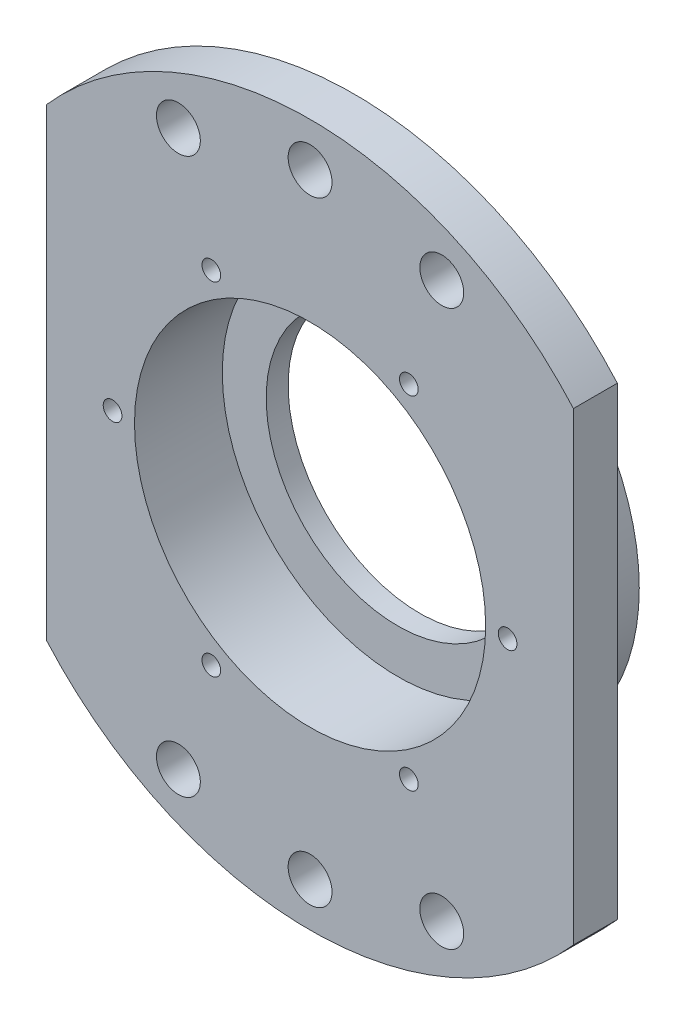
ISO-10303-21;
HEADER;
FILE_DESCRIPTION(('STEP AP214'),'2;1');
FILE_NAME('part.step','',(''),(''),'','','');
FILE_SCHEMA(('AUTOMOTIVE_DESIGN { 1 0 10303 214 1 1 1 1 }'));
ENDSEC;
DATA;
#1=APPLICATION_CONTEXT('core data for automotive mechanical design processes');
#2=APPLICATION_PROTOCOL_DEFINITION('international standard','automotive_design',2000,#1);
#3=PRODUCT_CONTEXT('',#1,'mechanical');
#4=PRODUCT('Part','Part','',(#3));
#5=PRODUCT_RELATED_PRODUCT_CATEGORY('part','',(#4));
#6=PRODUCT_DEFINITION_FORMATION('','',#4);
#7=PRODUCT_DEFINITION_CONTEXT('part definition',#1,'design');
#8=PRODUCT_DEFINITION('design','',#6,#7);
#9=PRODUCT_DEFINITION_SHAPE('','',#8);
#10=(LENGTH_UNIT() NAMED_UNIT(*) SI_UNIT(.MILLI.,.METRE.));
#11=(NAMED_UNIT(*) PLANE_ANGLE_UNIT() SI_UNIT($,.RADIAN.));
#12=(NAMED_UNIT(*) SI_UNIT($,.STERADIAN.) SOLID_ANGLE_UNIT());
#13=UNCERTAINTY_MEASURE_WITH_UNIT(LENGTH_MEASURE(1.E-05),#10,'distance_accuracy_value','');
#14=(GEOMETRIC_REPRESENTATION_CONTEXT(3) GLOBAL_UNCERTAINTY_ASSIGNED_CONTEXT((#13)) GLOBAL_UNIT_ASSIGNED_CONTEXT((#10,
#11,#12)) REPRESENTATION_CONTEXT('',''));
#15=CARTESIAN_POINT('',(0.,0.,0.));
#16=DIRECTION('',(0.,0.,1.));
#17=DIRECTION('',(1.,0.,0.));
#18=AXIS2_PLACEMENT_3D('',#15,#16,#17);
#19=CARTESIAN_POINT('',(0.,0.,7.9375));
#20=DIRECTION('',(0.,0.,-1.));
#21=DIRECTION('',(-1.,0.,0.));
#22=AXIS2_PLACEMENT_3D('',#19,#20,#21);
#23=PLANE('',#22);
#24=CARTESIAN_POINT('',(19.05,40.1609262841384,7.9375));
#25=DIRECTION('',(0.,0.,1.));
#26=DIRECTION('',(1.,0.,0.));
#27=AXIS2_PLACEMENT_3D('',#24,#25,#26);
#28=CIRCLE('',#27,3.17499999999999);
#29=CARTESIAN_POINT('',(22.225,40.1609262841384,7.9375));
#30=VERTEX_POINT('',#29);
#31=EDGE_CURVE('E179',#30,#30,#28,.T.);
#32=ORIENTED_EDGE('',*,*,#31,.F.);
#33=EDGE_LOOP('',(#32));
#34=FACE_BOUND('',#33,.T.);
#35=CARTESIAN_POINT('',(19.05,-40.1609262841384,7.9375));
#36=DIRECTION('',(0.,0.,1.));
#37=DIRECTION('',(1.,0.,0.));
#38=AXIS2_PLACEMENT_3D('',#35,#36,#37);
#39=CIRCLE('',#38,3.17499999999999);
#40=CARTESIAN_POINT('',(22.225,-40.1609262841384,7.9375));
#41=VERTEX_POINT('',#40);
#42=EDGE_CURVE('E164',#41,#41,#39,.T.);
#43=ORIENTED_EDGE('',*,*,#42,.F.);
#44=EDGE_LOOP('',(#43));
#45=FACE_BOUND('',#44,.T.);
#46=CARTESIAN_POINT('',(-19.05,-40.1609262841384,7.9375));
#47=DIRECTION('',(0.,0.,1.));
#48=DIRECTION('',(1.,0.,0.));
#49=AXIS2_PLACEMENT_3D('',#46,#47,#48);
#50=CIRCLE('',#49,3.17499999999999);
#51=CARTESIAN_POINT('',(-15.875,-40.1609262841384,7.9375));
#52=VERTEX_POINT('',#51);
#53=EDGE_CURVE('E160',#52,#52,#50,.T.);
#54=ORIENTED_EDGE('',*,*,#53,.F.);
#55=EDGE_LOOP('',(#54));
#56=FACE_BOUND('',#55,.T.);
#57=CARTESIAN_POINT('',(-19.05,40.1609262841384,7.9375));
#58=DIRECTION('',(0.,0.,1.));
#59=DIRECTION('',(1.,0.,0.));
#60=AXIS2_PLACEMENT_3D('',#57,#58,#59);
#61=CIRCLE('',#60,3.175);
#62=CARTESIAN_POINT('',(-15.875,40.1609262841384,7.9375));
#63=VERTEX_POINT('',#62);
#64=EDGE_CURVE('E159',#63,#63,#61,.T.);
#65=ORIENTED_EDGE('',*,*,#64,.F.);
#66=EDGE_LOOP('',(#65));
#67=FACE_BOUND('',#66,.T.);
#68=CARTESIAN_POINT('',(14.2875000000003,-24.7466759131402,7.9375));
#69=DIRECTION('',(0.,0.,1.));
#70=DIRECTION('',(1.,0.,0.));
#71=AXIS2_PLACEMENT_3D('',#68,#69,#70);
#72=CIRCLE('',#71,1.35255);
#73=CARTESIAN_POINT('',(15.6400500000003,-24.7466759131402,7.9375));
#74=VERTEX_POINT('',#73);
#75=EDGE_CURVE('E189',#74,#74,#72,.T.);
#76=ORIENTED_EDGE('',*,*,#75,.F.);
#77=EDGE_LOOP('',(#76));
#78=FACE_BOUND('',#77,.T.);
#79=CARTESIAN_POINT('',(-14.2874999999998,-24.7466759131405,7.9375));
#80=DIRECTION('',(0.,0.,1.));
#81=DIRECTION('',(1.,0.,0.));
#82=AXIS2_PLACEMENT_3D('',#79,#80,#81);
#83=CIRCLE('',#82,1.35255);
#84=CARTESIAN_POINT('',(-12.9349499999998,-24.7466759131405,7.9375));
#85=VERTEX_POINT('',#84);
#86=EDGE_CURVE('E197',#85,#85,#83,.T.);
#87=ORIENTED_EDGE('',*,*,#86,.F.);
#88=EDGE_LOOP('',(#87));
#89=FACE_BOUND('',#88,.T.);
#90=CARTESIAN_POINT('',(-28.575,0.,7.9375));
#91=DIRECTION('',(0.,0.,1.));
#92=DIRECTION('',(1.,0.,0.));
#93=AXIS2_PLACEMENT_3D('',#90,#91,#92);
#94=CIRCLE('',#93,1.35255);
#95=CARTESIAN_POINT('',(-27.22245,0.,7.9375));
#96=VERTEX_POINT('',#95);
#97=EDGE_CURVE('E205',#96,#96,#94,.T.);
#98=ORIENTED_EDGE('',*,*,#97,.F.);
#99=EDGE_LOOP('',(#98));
#100=FACE_BOUND('',#99,.T.);
#101=CARTESIAN_POINT('',(14.2874999999999,24.7466759131404,7.9375));
#102=DIRECTION('',(0.,0.,1.));
#103=DIRECTION('',(1.,0.,0.));
#104=AXIS2_PLACEMENT_3D('',#101,#102,#103);
#105=CIRCLE('',#104,1.35255);
#106=CARTESIAN_POINT('',(15.6400499999999,24.7466759131404,7.9375));
#107=VERTEX_POINT('',#106);
#108=EDGE_CURVE('E221',#107,#107,#105,.T.);
#109=ORIENTED_EDGE('',*,*,#108,.F.);
#110=EDGE_LOOP('',(#109));
#111=FACE_BOUND('',#110,.T.);
#112=CARTESIAN_POINT('',(28.575,0.,7.9375));
#113=DIRECTION('',(0.,0.,1.));
#114=DIRECTION('',(1.,0.,0.));
#115=AXIS2_PLACEMENT_3D('',#112,#113,#114);
#116=CIRCLE('',#115,1.35255);
#117=CARTESIAN_POINT('',(29.92755,0.,7.9375));
#118=VERTEX_POINT('',#117);
#119=EDGE_CURVE('E229',#118,#118,#116,.T.);
#120=ORIENTED_EDGE('',*,*,#119,.F.);
#121=EDGE_LOOP('',(#120));
#122=FACE_BOUND('',#121,.T.);
#123=CARTESIAN_POINT('',(0.,-44.45,7.9375));
#124=DIRECTION('',(0.,0.,1.));
#125=DIRECTION('',(-1.,0.,0.));
#126=AXIS2_PLACEMENT_3D('',#123,#124,#125);
#127=CIRCLE('',#126,3.175);
#128=CARTESIAN_POINT('',(-3.17499999999999,-44.45,7.9375));
#129=VERTEX_POINT('',#128);
#130=EDGE_CURVE('E155',#129,#129,#127,.T.);
#131=ORIENTED_EDGE('',*,*,#130,.F.);
#132=EDGE_LOOP('',(#131));
#133=FACE_BOUND('',#132,.T.);
#134=CARTESIAN_POINT('',(0.,44.45,7.9375));
#135=DIRECTION('',(0.,0.,1.));
#136=DIRECTION('',(1.,0.,0.));
#137=AXIS2_PLACEMENT_3D('',#134,#135,#136);
#138=CIRCLE('',#137,3.175);
#139=CARTESIAN_POINT('',(3.17499999999999,44.45,7.9375));
#140=VERTEX_POINT('',#139);
#141=EDGE_CURVE('E150',#140,#140,#138,.T.);
#142=ORIENTED_EDGE('',*,*,#141,.F.);
#143=EDGE_LOOP('',(#142));
#144=FACE_BOUND('',#143,.T.);
#145=CARTESIAN_POINT('',(0.,0.,7.9375));
#146=DIRECTION('',(0.,0.,1.));
#147=DIRECTION('',(1.,0.,0.));
#148=AXIS2_PLACEMENT_3D('',#145,#146,#147);
#149=CIRCLE('',#148,25.4);
#150=CARTESIAN_POINT('',(25.4,0.,7.9375));
#151=VERTEX_POINT('',#150);
#152=EDGE_CURVE('E149',#151,#151,#149,.T.);
#153=ORIENTED_EDGE('',*,*,#152,.F.);
#154=EDGE_LOOP('',(#153));
#155=FACE_BOUND('',#154,.T.);
#156=CARTESIAN_POINT('',(0.,0.,7.9375));
#157=DIRECTION('',(0.,0.,-1.));
#158=DIRECTION('',(-1.,0.,0.));
#159=AXIS2_PLACEMENT_3D('',#156,#157,#158);
#160=CIRCLE('',#159,50.8);
#161=CARTESIAN_POINT('',(38.1,-33.6010416505203,7.9375));
#162=VERTEX_POINT('',#161);
#163=CARTESIAN_POINT('',(-38.1,-33.6010416505203,7.9375));
#164=VERTEX_POINT('',#163);
#165=EDGE_CURVE('E116',#162,#164,#160,.T.);
#166=ORIENTED_EDGE('',*,*,#165,.F.);
#167=DIRECTION('',(0.,-1.,0.));
#168=VECTOR('',#167,1.);
#169=CARTESIAN_POINT('',(38.1,33.6010416505203,7.9375));
#170=LINE('',#169,#168);
#171=CARTESIAN_POINT('',(38.1,33.6010416505203,7.9375));
#172=VERTEX_POINT('',#171);
#173=EDGE_CURVE('E111',#172,#162,#170,.T.);
#174=ORIENTED_EDGE('',*,*,#173,.F.);
#175=CARTESIAN_POINT('',(0.,0.,7.9375));
#176=DIRECTION('',(0.,0.,-1.));
#177=DIRECTION('',(-1.,0.,0.));
#178=AXIS2_PLACEMENT_3D('',#175,#176,#177);
#179=CIRCLE('',#178,50.8);
#180=CARTESIAN_POINT('',(-38.1,33.6010416505203,7.9375));
#181=VERTEX_POINT('',#180);
#182=EDGE_CURVE('E102',#181,#172,#179,.T.);
#183=ORIENTED_EDGE('',*,*,#182,.F.);
#184=DIRECTION('',(0.,1.,0.));
#185=VECTOR('',#184,1.);
#186=CARTESIAN_POINT('',(-38.1,-33.6010416505203,7.9375));
#187=LINE('',#186,#185);
#188=EDGE_CURVE('E110',#164,#181,#187,.T.);
#189=ORIENTED_EDGE('',*,*,#188,.F.);
#190=EDGE_LOOP('',(#166,#174,#183,#189));
#191=FACE_BOUND('',#190,.T.);
#192=CARTESIAN_POINT('',(-14.2875000000001,24.7466759131403,7.9375));
#193=DIRECTION('',(0.,0.,1.));
#194=DIRECTION('',(1.,0.,0.));
#195=AXIS2_PLACEMENT_3D('',#192,#193,#194);
#196=CIRCLE('',#195,1.35255);
#197=CARTESIAN_POINT('',(-12.9349500000001,24.7466759131403,7.9375));
#198=VERTEX_POINT('',#197);
#199=EDGE_CURVE('E213',#198,#198,#196,.T.);
#200=ORIENTED_EDGE('',*,*,#199,.F.);
#201=EDGE_LOOP('',(#200));
#202=FACE_BOUND('',#201,.T.);
#203=ADVANCED_FACE('F49',(#34,#45,#56,#67,#78,#89,#100,#111,#122,#133,#144,#155,#191,#202),#23,.F.);
#204=CARTESIAN_POINT('',(31.75,0.,-7.9375));
#205=DIRECTION('',(0.,0.,-1.));
#206=DIRECTION('',(-1.,0.,0.));
#207=AXIS2_PLACEMENT_3D('',#204,#205,#206);
#208=PLANE('',#207);
#209=CARTESIAN_POINT('',(14.2875000000003,-24.7466759131402,-7.9375));
#210=DIRECTION('',(0.,0.,1.));
#211=DIRECTION('',(1.,0.,0.));
#212=AXIS2_PLACEMENT_3D('',#209,#210,#211);
#213=CIRCLE('',#212,1.35255);
#214=CARTESIAN_POINT('',(15.6400500000003,-24.7466759131402,-7.9375));
#215=VERTEX_POINT('',#214);
#216=EDGE_CURVE('E193',#215,#215,#213,.T.);
#217=ORIENTED_EDGE('',*,*,#216,.T.);
#218=EDGE_LOOP('',(#217));
#219=FACE_BOUND('',#218,.T.);
#220=CARTESIAN_POINT('',(-14.2874999999998,-24.7466759131405,-7.9375));
#221=DIRECTION('',(0.,0.,1.));
#222=DIRECTION('',(1.,0.,0.));
#223=AXIS2_PLACEMENT_3D('',#220,#221,#222);
#224=CIRCLE('',#223,1.35254999999999);
#225=CARTESIAN_POINT('',(-12.9349499999998,-24.7466759131405,-7.9375));
#226=VERTEX_POINT('',#225);
#227=EDGE_CURVE('E201',#226,#226,#224,.T.);
#228=ORIENTED_EDGE('',*,*,#227,.T.);
#229=EDGE_LOOP('',(#228));
#230=FACE_BOUND('',#229,.T.);
#231=CARTESIAN_POINT('',(-28.575,0.,-7.9375));
#232=DIRECTION('',(0.,0.,1.));
#233=DIRECTION('',(1.,0.,0.));
#234=AXIS2_PLACEMENT_3D('',#231,#232,#233);
#235=CIRCLE('',#234,1.35254999999999);
#236=CARTESIAN_POINT('',(-27.22245,0.,-7.9375));
#237=VERTEX_POINT('',#236);
#238=EDGE_CURVE('E209',#237,#237,#235,.T.);
#239=ORIENTED_EDGE('',*,*,#238,.T.);
#240=EDGE_LOOP('',(#239));
#241=FACE_BOUND('',#240,.T.);
#242=CARTESIAN_POINT('',(-14.2875000000001,24.7466759131403,-7.9375));
#243=DIRECTION('',(0.,0.,1.));
#244=DIRECTION('',(1.,0.,0.));
#245=AXIS2_PLACEMENT_3D('',#242,#243,#244);
#246=CIRCLE('',#245,1.35254999999999);
#247=CARTESIAN_POINT('',(-12.9349500000001,24.7466759131403,-7.9375));
#248=VERTEX_POINT('',#247);
#249=EDGE_CURVE('E217',#248,#248,#246,.T.);
#250=ORIENTED_EDGE('',*,*,#249,.T.);
#251=EDGE_LOOP('',(#250));
#252=FACE_BOUND('',#251,.T.);
#253=CARTESIAN_POINT('',(0.,0.,-7.9375));
#254=DIRECTION('',(0.,0.,1.));
#255=DIRECTION('',(1.,0.,0.));
#256=AXIS2_PLACEMENT_3D('',#253,#254,#255);
#257=CIRCLE('',#256,31.75);
#258=CARTESIAN_POINT('',(31.75,0.,-7.9375));
#259=VERTEX_POINT('',#258);
#260=EDGE_CURVE('E131',#259,#259,#257,.T.);
#261=ORIENTED_EDGE('',*,*,#260,.F.);
#262=EDGE_LOOP('',(#261));
#263=FACE_BOUND('',#262,.T.);
#264=CARTESIAN_POINT('',(0.,0.,-7.9375));
#265=DIRECTION('',(0.,0.,1.));
#266=DIRECTION('',(1.,0.,0.));
#267=AXIS2_PLACEMENT_3D('',#264,#265,#266);
#268=CIRCLE('',#267,19.05);
#269=CARTESIAN_POINT('',(19.05,0.,-7.9375));
#270=VERTEX_POINT('',#269);
#271=EDGE_CURVE('E254',#270,#270,#268,.T.);
#272=ORIENTED_EDGE('',*,*,#271,.T.);
#273=EDGE_LOOP('',(#272));
#274=FACE_BOUND('',#273,.T.);
#275=CARTESIAN_POINT('',(28.575,0.,-7.9375));
#276=DIRECTION('',(0.,0.,1.));
#277=DIRECTION('',(1.,0.,0.));
#278=AXIS2_PLACEMENT_3D('',#275,#276,#277);
#279=CIRCLE('',#278,1.35254999999999);
#280=CARTESIAN_POINT('',(29.92755,0.,-7.9375));
#281=VERTEX_POINT('',#280);
#282=EDGE_CURVE('E233',#281,#281,#279,.T.);
#283=ORIENTED_EDGE('',*,*,#282,.T.);
#284=EDGE_LOOP('',(#283));
#285=FACE_BOUND('',#284,.T.);
#286=CARTESIAN_POINT('',(14.2874999999999,24.7466759131404,-7.9375));
#287=DIRECTION('',(0.,0.,1.));
#288=DIRECTION('',(1.,0.,0.));
#289=AXIS2_PLACEMENT_3D('',#286,#287,#288);
#290=CIRCLE('',#289,1.35254999999999);
#291=CARTESIAN_POINT('',(15.6400499999999,24.7466759131404,-7.9375));
#292=VERTEX_POINT('',#291);
#293=EDGE_CURVE('E225',#292,#292,#290,.T.);
#294=ORIENTED_EDGE('',*,*,#293,.T.);
#295=EDGE_LOOP('',(#294));
#296=FACE_BOUND('',#295,.T.);
#297=ADVANCED_FACE('F265',(#219,#230,#241,#252,#263,#274,#285,#296),#208,.T.);
#298=CARTESIAN_POINT('',(0.,0.,7.9375));
#299=DIRECTION('',(0.,0.,-1.));
#300=DIRECTION('',(-1.,0.,0.));
#301=AXIS2_PLACEMENT_3D('',#298,#299,#300);
#302=CYLINDRICAL_SURFACE('',#301,50.8);
#303=CARTESIAN_POINT('',(0.,0.,1.5875));
#304=DIRECTION('',(0.,0.,-1.));
#305=DIRECTION('',(-1.,0.,0.));
#306=AXIS2_PLACEMENT_3D('',#303,#304,#305);
#307=CIRCLE('',#306,50.8);
#308=CARTESIAN_POINT('',(38.1,-33.6010416505203,1.5875));
#309=VERTEX_POINT('',#308);
#310=CARTESIAN_POINT('',(-38.1,-33.6010416505203,1.5875));
#311=VERTEX_POINT('',#310);
#312=EDGE_CURVE('E126',#309,#311,#307,.T.);
#313=ORIENTED_EDGE('',*,*,#312,.F.);
#314=DIRECTION('',(0.,0.,-1.));
#315=VECTOR('',#314,1.);
#316=CARTESIAN_POINT('',(38.1,-33.6010416505203,7.9375));
#317=LINE('',#316,#315);
#318=EDGE_CURVE('E60',#162,#309,#317,.T.);
#319=ORIENTED_EDGE('',*,*,#318,.F.);
#320=ORIENTED_EDGE('',*,*,#165,.T.);
#321=DIRECTION('',(0.,0.,-1.));
#322=VECTOR('',#321,1.);
#323=CARTESIAN_POINT('',(-38.1,-33.6010416505203,7.9375));
#324=LINE('',#323,#322);
#325=EDGE_CURVE('E96',#164,#311,#324,.T.);
#326=ORIENTED_EDGE('',*,*,#325,.T.);
#327=EDGE_LOOP('',(#313,#319,#320,#326));
#328=FACE_BOUND('',#327,.T.);
#329=ADVANCED_FACE('F51',(#328),#302,.T.);
#330=CARTESIAN_POINT('',(38.1,33.6010416505203,7.9375));
#331=DIRECTION('',(1.,0.,0.));
#332=DIRECTION('',(0.,1.,0.));
#333=AXIS2_PLACEMENT_3D('',#330,#331,#332);
#334=PLANE('',#333);
#335=DIRECTION('',(0.,-1.,0.));
#336=VECTOR('',#335,1.);
#337=CARTESIAN_POINT('',(38.1,33.6010416505203,1.5875));
#338=LINE('',#337,#336);
#339=CARTESIAN_POINT('',(38.1,33.6010416505203,1.5875));
#340=VERTEX_POINT('',#339);
#341=EDGE_CURVE('E120',#340,#309,#338,.T.);
#342=ORIENTED_EDGE('',*,*,#341,.F.);
#343=DIRECTION('',(0.,0.,-1.));
#344=VECTOR('',#343,1.);
#345=CARTESIAN_POINT('',(38.1,33.6010416505203,7.9375));
#346=LINE('',#345,#344);
#347=EDGE_CURVE('E85',#172,#340,#346,.T.);
#348=ORIENTED_EDGE('',*,*,#347,.F.);
#349=ORIENTED_EDGE('',*,*,#173,.T.);
#350=ORIENTED_EDGE('',*,*,#318,.T.);
#351=EDGE_LOOP('',(#342,#348,#349,#350));
#352=FACE_BOUND('',#351,.T.);
#353=ADVANCED_FACE('F324',(#352),#334,.T.);
#354=CARTESIAN_POINT('',(0.,0.,7.9375));
#355=DIRECTION('',(0.,0.,-1.));
#356=DIRECTION('',(-1.,0.,0.));
#357=AXIS2_PLACEMENT_3D('',#354,#355,#356);
#358=CYLINDRICAL_SURFACE('',#357,50.8);
#359=CARTESIAN_POINT('',(0.,0.,1.5875));
#360=DIRECTION('',(0.,0.,-1.));
#361=DIRECTION('',(-1.,0.,0.));
#362=AXIS2_PLACEMENT_3D('',#359,#360,#361);
#363=CIRCLE('',#362,50.8);
#364=CARTESIAN_POINT('',(-38.1,33.6010416505203,1.5875));
#365=VERTEX_POINT('',#364);
#366=EDGE_CURVE('E104',#365,#340,#363,.T.);
#367=ORIENTED_EDGE('',*,*,#366,.F.);
#368=DIRECTION('',(0.,0.,-1.));
#369=VECTOR('',#368,1.);
#370=CARTESIAN_POINT('',(-38.1,33.6010416505203,7.9375));
#371=LINE('',#370,#369);
#372=EDGE_CURVE('E99',#181,#365,#371,.T.);
#373=ORIENTED_EDGE('',*,*,#372,.F.);
#374=ORIENTED_EDGE('',*,*,#182,.T.);
#375=ORIENTED_EDGE('',*,*,#347,.T.);
#376=EDGE_LOOP('',(#367,#373,#374,#375));
#377=FACE_BOUND('',#376,.T.);
#378=ADVANCED_FACE('F101',(#377),#358,.T.);
#379=CARTESIAN_POINT('',(-38.1,-33.6010416505203,7.9375));
#380=DIRECTION('',(-1.,0.,0.));
#381=DIRECTION('',(0.,0.,1.));
#382=AXIS2_PLACEMENT_3D('',#379,#380,#381);
#383=PLANE('',#382);
#384=DIRECTION('',(0.,1.,0.));
#385=VECTOR('',#384,1.);
#386=CARTESIAN_POINT('',(-38.1,-33.6010416505203,1.5875));
#387=LINE('',#386,#385);
#388=EDGE_CURVE('E130',#311,#365,#387,.T.);
#389=ORIENTED_EDGE('',*,*,#388,.F.);
#390=ORIENTED_EDGE('',*,*,#325,.F.);
#391=ORIENTED_EDGE('',*,*,#188,.T.);
#392=ORIENTED_EDGE('',*,*,#372,.T.);
#393=EDGE_LOOP('',(#389,#390,#391,#392));
#394=FACE_BOUND('',#393,.T.);
#395=ADVANCED_FACE('F114',(#394),#383,.T.);
#396=CARTESIAN_POINT('',(0.,0.,1.5875));
#397=DIRECTION('',(0.,0.,-1.));
#398=DIRECTION('',(-1.,0.,0.));
#399=AXIS2_PLACEMENT_3D('',#396,#397,#398);
#400=PLANE('',#399);
#401=CARTESIAN_POINT('',(19.05,40.1609262841384,1.5875));
#402=DIRECTION('',(0.,0.,-1.));
#403=DIRECTION('',(-1.,0.,0.));
#404=AXIS2_PLACEMENT_3D('',#401,#402,#403);
#405=CIRCLE('',#404,3.17499999999999);
#406=CARTESIAN_POINT('',(15.875,40.1609262841384,1.5875));
#407=VERTEX_POINT('',#406);
#408=EDGE_CURVE('E53',#407,#407,#405,.T.);
#409=ORIENTED_EDGE('',*,*,#408,.F.);
#410=EDGE_LOOP('',(#409));
#411=FACE_BOUND('',#410,.T.);
#412=CARTESIAN_POINT('',(19.05,-40.1609262841384,1.5875));
#413=DIRECTION('',(0.,0.,-1.));
#414=DIRECTION('',(-1.,0.,0.));
#415=AXIS2_PLACEMENT_3D('',#412,#413,#414);
#416=CIRCLE('',#415,3.17499999999999);
#417=CARTESIAN_POINT('',(15.875,-40.1609262841384,1.5875));
#418=VERTEX_POINT('',#417);
#419=EDGE_CURVE('E161',#418,#418,#416,.T.);
#420=ORIENTED_EDGE('',*,*,#419,.F.);
#421=EDGE_LOOP('',(#420));
#422=FACE_BOUND('',#421,.T.);
#423=CARTESIAN_POINT('',(-19.05,-40.1609262841384,1.5875));
#424=DIRECTION('',(0.,0.,-1.));
#425=DIRECTION('',(-1.,0.,0.));
#426=AXIS2_PLACEMENT_3D('',#423,#424,#425);
#427=CIRCLE('',#426,3.17499999999999);
#428=CARTESIAN_POINT('',(-22.225,-40.1609262841384,1.5875));
#429=VERTEX_POINT('',#428);
#430=EDGE_CURVE('E156',#429,#429,#427,.T.);
#431=ORIENTED_EDGE('',*,*,#430,.F.);
#432=EDGE_LOOP('',(#431));
#433=FACE_BOUND('',#432,.T.);
#434=CARTESIAN_POINT('',(-19.05,40.1609262841384,1.5875));
#435=DIRECTION('',(0.,0.,-1.));
#436=DIRECTION('',(-1.,0.,0.));
#437=AXIS2_PLACEMENT_3D('',#434,#435,#436);
#438=CIRCLE('',#437,3.175);
#439=CARTESIAN_POINT('',(-22.225,40.1609262841384,1.5875));
#440=VERTEX_POINT('',#439);
#441=EDGE_CURVE('E185',#440,#440,#438,.T.);
#442=ORIENTED_EDGE('',*,*,#441,.F.);
#443=EDGE_LOOP('',(#442));
#444=FACE_BOUND('',#443,.T.);
#445=CARTESIAN_POINT('',(0.,-44.45,1.5875));
#446=DIRECTION('',(0.,0.,-1.));
#447=DIRECTION('',(-1.,0.,0.));
#448=AXIS2_PLACEMENT_3D('',#445,#446,#447);
#449=CIRCLE('',#448,3.175);
#450=CARTESIAN_POINT('',(-3.17499999999999,-44.45,1.5875));
#451=VERTEX_POINT('',#450);
#452=EDGE_CURVE('E151',#451,#451,#449,.T.);
#453=ORIENTED_EDGE('',*,*,#452,.F.);
#454=EDGE_LOOP('',(#453));
#455=FACE_BOUND('',#454,.T.);
#456=CARTESIAN_POINT('',(0.,44.45,1.5875));
#457=DIRECTION('',(0.,0.,-1.));
#458=DIRECTION('',(-1.,0.,0.));
#459=AXIS2_PLACEMENT_3D('',#456,#457,#458);
#460=CIRCLE('',#459,3.175);
#461=CARTESIAN_POINT('',(-3.175,44.45,1.5875));
#462=VERTEX_POINT('',#461);
#463=EDGE_CURVE('E145',#462,#462,#460,.T.);
#464=ORIENTED_EDGE('',*,*,#463,.F.);
#465=EDGE_LOOP('',(#464));
#466=FACE_BOUND('',#465,.T.);
#467=CARTESIAN_POINT('',(0.,0.,1.5875));
#468=DIRECTION('',(0.,0.,-1.));
#469=DIRECTION('',(-1.,0.,0.));
#470=AXIS2_PLACEMENT_3D('',#467,#468,#469);
#471=CIRCLE('',#470,31.75);
#472=CARTESIAN_POINT('',(-31.75,0.,1.5875));
#473=VERTEX_POINT('',#472);
#474=EDGE_CURVE('E11',#473,#473,#471,.T.);
#475=ORIENTED_EDGE('',*,*,#474,.F.);
#476=EDGE_LOOP('',(#475));
#477=FACE_BOUND('',#476,.T.);
#478=ORIENTED_EDGE('',*,*,#312,.T.);
#479=ORIENTED_EDGE('',*,*,#388,.T.);
#480=ORIENTED_EDGE('',*,*,#366,.T.);
#481=ORIENTED_EDGE('',*,*,#341,.T.);
#482=EDGE_LOOP('',(#478,#479,#480,#481));
#483=FACE_BOUND('',#482,.T.);
#484=ADVANCED_FACE('F319',(#411,#422,#433,#444,#455,#466,#477,#483),#400,.T.);
#485=CARTESIAN_POINT('',(0.,0.,-7.9375));
#486=DIRECTION('',(0.,0.,1.));
#487=DIRECTION('',(1.,0.,0.));
#488=AXIS2_PLACEMENT_3D('',#485,#486,#487);
#489=CYLINDRICAL_SURFACE('',#488,31.75);
#490=ORIENTED_EDGE('',*,*,#260,.T.);
#491=EDGE_LOOP('',(#490));
#492=FACE_BOUND('',#491,.T.);
#493=ORIENTED_EDGE('',*,*,#474,.T.);
#494=EDGE_LOOP('',(#493));
#495=FACE_BOUND('',#494,.T.);
#496=ADVANCED_FACE('F262',(#492,#495),#489,.T.);
#497=CARTESIAN_POINT('',(0.,0.,7.9375));
#498=DIRECTION('',(0.,0.,1.));
#499=DIRECTION('',(1.,0.,0.));
#500=AXIS2_PLACEMENT_3D('',#497,#498,#499);
#501=CYLINDRICAL_SURFACE('',#500,19.05);
#502=ORIENTED_EDGE('',*,*,#271,.F.);
#503=EDGE_LOOP('',(#502));
#504=FACE_BOUND('',#503,.T.);
#505=CARTESIAN_POINT('',(0.,0.,-4.7625));
#506=DIRECTION('',(0.,0.,1.));
#507=DIRECTION('',(1.,0.,0.));
#508=AXIS2_PLACEMENT_3D('',#505,#506,#507);
#509=CIRCLE('',#508,19.05);
#510=CARTESIAN_POINT('',(19.05,0.,-4.7625));
#511=VERTEX_POINT('',#510);
#512=EDGE_CURVE('E250',#511,#511,#509,.T.);
#513=ORIENTED_EDGE('',*,*,#512,.T.);
#514=EDGE_LOOP('',(#513));
#515=FACE_BOUND('',#514,.T.);
#516=ADVANCED_FACE('F309',(#504,#515),#501,.F.);
#517=CARTESIAN_POINT('',(19.05,0.,-4.7625));
#518=DIRECTION('',(0.,0.,-1.));
#519=DIRECTION('',(-1.,0.,0.));
#520=AXIS2_PLACEMENT_3D('',#517,#518,#519);
#521=PLANE('',#520);
#522=ORIENTED_EDGE('',*,*,#512,.F.);
#523=EDGE_LOOP('',(#522));
#524=FACE_BOUND('',#523,.T.);
#525=CARTESIAN_POINT('',(0.,0.,-4.7625));
#526=DIRECTION('',(0.,0.,1.));
#527=DIRECTION('',(1.,0.,0.));
#528=AXIS2_PLACEMENT_3D('',#525,#526,#527);
#529=CIRCLE('',#528,25.4);
#530=CARTESIAN_POINT('',(25.4,0.,-4.7625));
#531=VERTEX_POINT('',#530);
#532=EDGE_CURVE('E246',#531,#531,#529,.T.);
#533=ORIENTED_EDGE('',*,*,#532,.T.);
#534=EDGE_LOOP('',(#533));
#535=FACE_BOUND('',#534,.T.);
#536=ADVANCED_FACE('F299',(#524,#535),#521,.F.);
#537=CARTESIAN_POINT('',(0.,0.,7.9375));
#538=DIRECTION('',(0.,0.,1.));
#539=DIRECTION('',(1.,0.,0.));
#540=AXIS2_PLACEMENT_3D('',#537,#538,#539);
#541=CYLINDRICAL_SURFACE('',#540,25.4);
#542=ORIENTED_EDGE('',*,*,#532,.F.);
#543=EDGE_LOOP('',(#542));
#544=FACE_BOUND('',#543,.T.);
#545=ORIENTED_EDGE('',*,*,#152,.T.);
#546=EDGE_LOOP('',(#545));
#547=FACE_BOUND('',#546,.T.);
#548=ADVANCED_FACE('F296',(#544,#547),#541,.F.);
#549=CARTESIAN_POINT('',(0.,44.45,-7.9375));
#550=DIRECTION('',(0.,0.,1.));
#551=DIRECTION('',(1.,0.,0.));
#552=AXIS2_PLACEMENT_3D('',#549,#550,#551);
#553=CYLINDRICAL_SURFACE('',#552,3.175);
#554=ORIENTED_EDGE('',*,*,#463,.T.);
#555=EDGE_LOOP('',(#554));
#556=FACE_BOUND('',#555,.T.);
#557=ORIENTED_EDGE('',*,*,#141,.T.);
#558=EDGE_LOOP('',(#557));
#559=FACE_BOUND('',#558,.T.);
#560=ADVANCED_FACE('F298',(#556,#559),#553,.F.);
#561=CARTESIAN_POINT('',(0.,-44.45,-7.9375));
#562=DIRECTION('',(0.,0.,1.));
#563=DIRECTION('',(1.,0.,0.));
#564=AXIS2_PLACEMENT_3D('',#561,#562,#563);
#565=CYLINDRICAL_SURFACE('',#564,3.175);
#566=ORIENTED_EDGE('',*,*,#452,.T.);
#567=EDGE_LOOP('',(#566));
#568=FACE_BOUND('',#567,.T.);
#569=ORIENTED_EDGE('',*,*,#130,.T.);
#570=EDGE_LOOP('',(#569));
#571=FACE_BOUND('',#570,.T.);
#572=ADVANCED_FACE('F306',(#568,#571),#565,.F.);
#573=CARTESIAN_POINT('',(28.575,0.,7.9375));
#574=DIRECTION('',(0.,0.,1.));
#575=DIRECTION('',(1.,0.,0.));
#576=AXIS2_PLACEMENT_3D('',#573,#574,#575);
#577=CYLINDRICAL_SURFACE('',#576,1.35255);
#578=ORIENTED_EDGE('',*,*,#282,.F.);
#579=EDGE_LOOP('',(#578));
#580=FACE_BOUND('',#579,.T.);
#581=ORIENTED_EDGE('',*,*,#119,.T.);
#582=EDGE_LOOP('',(#581));
#583=FACE_BOUND('',#582,.T.);
#584=ADVANCED_FACE('F280',(#580,#583),#577,.F.);
#585=CARTESIAN_POINT('',(14.2874999999999,24.7466759131404,7.9375));
#586=DIRECTION('',(0.,0.,1.));
#587=DIRECTION('',(1.,0.,0.));
#588=AXIS2_PLACEMENT_3D('',#585,#586,#587);
#589=CYLINDRICAL_SURFACE('',#588,1.35255);
#590=ORIENTED_EDGE('',*,*,#293,.F.);
#591=EDGE_LOOP('',(#590));
#592=FACE_BOUND('',#591,.T.);
#593=ORIENTED_EDGE('',*,*,#108,.T.);
#594=EDGE_LOOP('',(#593));
#595=FACE_BOUND('',#594,.T.);
#596=ADVANCED_FACE('F276',(#592,#595),#589,.F.);
#597=CARTESIAN_POINT('',(-14.2875000000001,24.7466759131403,7.9375));
#598=DIRECTION('',(0.,0.,1.));
#599=DIRECTION('',(1.,0.,0.));
#600=AXIS2_PLACEMENT_3D('',#597,#598,#599);
#601=CYLINDRICAL_SURFACE('',#600,1.35254999999999);
#602=ORIENTED_EDGE('',*,*,#249,.F.);
#603=EDGE_LOOP('',(#602));
#604=FACE_BOUND('',#603,.T.);
#605=ORIENTED_EDGE('',*,*,#199,.T.);
#606=EDGE_LOOP('',(#605));
#607=FACE_BOUND('',#606,.T.);
#608=ADVANCED_FACE('F279',(#604,#607),#601,.F.);
#609=CARTESIAN_POINT('',(-28.575,0.,7.9375));
#610=DIRECTION('',(0.,0.,1.));
#611=DIRECTION('',(1.,0.,0.));
#612=AXIS2_PLACEMENT_3D('',#609,#610,#611);
#613=CYLINDRICAL_SURFACE('',#612,1.35255);
#614=ORIENTED_EDGE('',*,*,#238,.F.);
#615=EDGE_LOOP('',(#614));
#616=FACE_BOUND('',#615,.T.);
#617=ORIENTED_EDGE('',*,*,#97,.T.);
#618=EDGE_LOOP('',(#617));
#619=FACE_BOUND('',#618,.T.);
#620=ADVANCED_FACE('F407',(#616,#619),#613,.F.);
#621=CARTESIAN_POINT('',(-14.2874999999998,-24.7466759131405,7.9375));
#622=DIRECTION('',(0.,0.,1.));
#623=DIRECTION('',(1.,0.,0.));
#624=AXIS2_PLACEMENT_3D('',#621,#622,#623);
#625=CYLINDRICAL_SURFACE('',#624,1.35255);
#626=ORIENTED_EDGE('',*,*,#227,.F.);
#627=EDGE_LOOP('',(#626));
#628=FACE_BOUND('',#627,.T.);
#629=ORIENTED_EDGE('',*,*,#86,.T.);
#630=EDGE_LOOP('',(#629));
#631=FACE_BOUND('',#630,.T.);
#632=ADVANCED_FACE('F419',(#628,#631),#625,.F.);
#633=CARTESIAN_POINT('',(14.2875000000003,-24.7466759131402,7.9375));
#634=DIRECTION('',(0.,0.,1.));
#635=DIRECTION('',(1.,0.,0.));
#636=AXIS2_PLACEMENT_3D('',#633,#634,#635);
#637=CYLINDRICAL_SURFACE('',#636,1.35255);
#638=ORIENTED_EDGE('',*,*,#216,.F.);
#639=EDGE_LOOP('',(#638));
#640=FACE_BOUND('',#639,.T.);
#641=ORIENTED_EDGE('',*,*,#75,.T.);
#642=EDGE_LOOP('',(#641));
#643=FACE_BOUND('',#642,.T.);
#644=ADVANCED_FACE('F431',(#640,#643),#637,.F.);
#645=CARTESIAN_POINT('',(-19.05,40.1609262841384,7.9375));
#646=DIRECTION('',(0.,0.,1.));
#647=DIRECTION('',(1.,0.,0.));
#648=AXIS2_PLACEMENT_3D('',#645,#646,#647);
#649=CYLINDRICAL_SURFACE('',#648,3.175);
#650=ORIENTED_EDGE('',*,*,#441,.T.);
#651=EDGE_LOOP('',(#650));
#652=FACE_BOUND('',#651,.T.);
#653=ORIENTED_EDGE('',*,*,#64,.T.);
#654=EDGE_LOOP('',(#653));
#655=FACE_BOUND('',#654,.T.);
#656=ADVANCED_FACE('F442',(#652,#655),#649,.F.);
#657=CARTESIAN_POINT('',(-19.05,-40.1609262841384,7.9375));
#658=DIRECTION('',(0.,0.,1.));
#659=DIRECTION('',(1.,0.,0.));
#660=AXIS2_PLACEMENT_3D('',#657,#658,#659);
#661=CYLINDRICAL_SURFACE('',#660,3.17499999999999);
#662=ORIENTED_EDGE('',*,*,#430,.T.);
#663=EDGE_LOOP('',(#662));
#664=FACE_BOUND('',#663,.T.);
#665=ORIENTED_EDGE('',*,*,#53,.T.);
#666=EDGE_LOOP('',(#665));
#667=FACE_BOUND('',#666,.T.);
#668=ADVANCED_FACE('F452',(#664,#667),#661,.F.);
#669=CARTESIAN_POINT('',(19.05,-40.1609262841384,7.9375));
#670=DIRECTION('',(0.,0.,1.));
#671=DIRECTION('',(1.,0.,0.));
#672=AXIS2_PLACEMENT_3D('',#669,#670,#671);
#673=CYLINDRICAL_SURFACE('',#672,3.17499999999999);
#674=ORIENTED_EDGE('',*,*,#419,.T.);
#675=EDGE_LOOP('',(#674));
#676=FACE_BOUND('',#675,.T.);
#677=ORIENTED_EDGE('',*,*,#42,.T.);
#678=EDGE_LOOP('',(#677));
#679=FACE_BOUND('',#678,.T.);
#680=ADVANCED_FACE('F468',(#676,#679),#673,.F.);
#681=CARTESIAN_POINT('',(19.05,40.1609262841384,7.9375));
#682=DIRECTION('',(0.,0.,1.));
#683=DIRECTION('',(1.,0.,0.));
#684=AXIS2_PLACEMENT_3D('',#681,#682,#683);
#685=CYLINDRICAL_SURFACE('',#684,3.17499999999999);
#686=ORIENTED_EDGE('',*,*,#408,.T.);
#687=EDGE_LOOP('',(#686));
#688=FACE_BOUND('',#687,.T.);
#689=ORIENTED_EDGE('',*,*,#31,.T.);
#690=EDGE_LOOP('',(#689));
#691=FACE_BOUND('',#690,.T.);
#692=ADVANCED_FACE('F475',(#688,#691),#685,.F.);
#693=CLOSED_SHELL('',(#203,#297,#329,#353,#378,#395,#484,#496,#516,#536,#548,#560,#572,#584,
#596,#608,#620,#632,#644,#656,#668,#680,#692));
#694=MANIFOLD_SOLID_BREP('B2',#693);
#695=ADVANCED_BREP_SHAPE_REPRESENTATION('',(#18,#694),#14);
#696=SHAPE_DEFINITION_REPRESENTATION(#9,#695);
ENDSEC;
END-ISO-10303-21;
